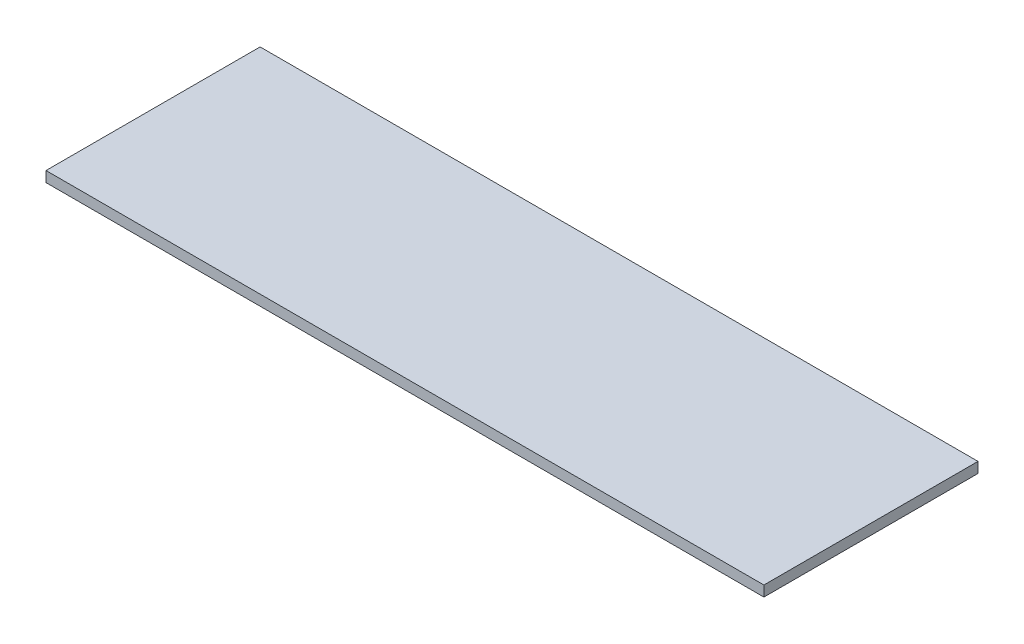
ISO-10303-21;
HEADER;
FILE_DESCRIPTION(('STEP AP214'),'2;1');
FILE_NAME('part.step','',(''),(''),'','','');
FILE_SCHEMA(('AUTOMOTIVE_DESIGN { 1 0 10303 214 1 1 1 1 }'));
ENDSEC;
DATA;
#1=APPLICATION_CONTEXT('core data for automotive mechanical design processes');
#2=APPLICATION_PROTOCOL_DEFINITION('international standard','automotive_design',2000,#1);
#3=PRODUCT_CONTEXT('',#1,'mechanical');
#4=PRODUCT('Part','Part','',(#3));
#5=PRODUCT_RELATED_PRODUCT_CATEGORY('part','',(#4));
#6=PRODUCT_DEFINITION_FORMATION('','',#4);
#7=PRODUCT_DEFINITION_CONTEXT('part definition',#1,'design');
#8=PRODUCT_DEFINITION('design','',#6,#7);
#9=PRODUCT_DEFINITION_SHAPE('','',#8);
#10=(LENGTH_UNIT() NAMED_UNIT(*) SI_UNIT(.MILLI.,.METRE.));
#11=(NAMED_UNIT(*) PLANE_ANGLE_UNIT() SI_UNIT($,.RADIAN.));
#12=(NAMED_UNIT(*) SI_UNIT($,.STERADIAN.) SOLID_ANGLE_UNIT());
#13=UNCERTAINTY_MEASURE_WITH_UNIT(LENGTH_MEASURE(1.E-05),#10,'distance_accuracy_value','');
#14=(GEOMETRIC_REPRESENTATION_CONTEXT(3) GLOBAL_UNCERTAINTY_ASSIGNED_CONTEXT((#13)) GLOBAL_UNIT_ASSIGNED_CONTEXT((#10,
#11,#12)) REPRESENTATION_CONTEXT('',''));
#15=CARTESIAN_POINT('',(0.,0.,0.));
#16=DIRECTION('',(0.,0.,1.));
#17=DIRECTION('',(1.,0.,0.));
#18=AXIS2_PLACEMENT_3D('',#15,#16,#17);
#19=CARTESIAN_POINT('',(171.,5.,-51.));
#20=DIRECTION('',(-1.,0.,0.));
#21=DIRECTION('',(0.,0.,1.));
#22=AXIS2_PLACEMENT_3D('',#19,#20,#21);
#23=PLANE('',#22);
#24=DIRECTION('',(0.,0.,-1.));
#25=VECTOR('',#24,1.);
#26=CARTESIAN_POINT('',(171.,0.,-51.));
#27=LINE('',#26,#25);
#28=CARTESIAN_POINT('',(171.,0.,51.));
#29=VERTEX_POINT('',#28);
#30=CARTESIAN_POINT('',(171.,0.,-51.));
#31=VERTEX_POINT('',#30);
#32=EDGE_CURVE('E96',#29,#31,#27,.T.);
#33=ORIENTED_EDGE('',*,*,#32,.T.);
#34=DIRECTION('',(0.,-1.,0.));
#35=VECTOR('',#34,1.);
#36=CARTESIAN_POINT('',(171.,5.,-51.));
#37=LINE('',#36,#35);
#38=CARTESIAN_POINT('',(171.,5.,-51.));
#39=VERTEX_POINT('',#38);
#40=EDGE_CURVE('E11',#39,#31,#37,.T.);
#41=ORIENTED_EDGE('',*,*,#40,.F.);
#42=DIRECTION('',(0.,0.,-1.));
#43=VECTOR('',#42,1.);
#44=CARTESIAN_POINT('',(171.,5.,-51.));
#45=LINE('',#44,#43);
#46=CARTESIAN_POINT('',(171.,5.,51.));
#47=VERTEX_POINT('',#46);
#48=EDGE_CURVE('E84',#47,#39,#45,.T.);
#49=ORIENTED_EDGE('',*,*,#48,.F.);
#50=DIRECTION('',(0.,-1.,0.));
#51=VECTOR('',#50,1.);
#52=CARTESIAN_POINT('',(171.,5.,51.));
#53=LINE('',#52,#51);
#54=EDGE_CURVE('E92',#47,#29,#53,.T.);
#55=ORIENTED_EDGE('',*,*,#54,.T.);
#56=EDGE_LOOP('',(#33,#41,#49,#55));
#57=FACE_BOUND('',#56,.T.);
#58=ADVANCED_FACE('F33',(#57),#23,.F.);
#59=CARTESIAN_POINT('',(-171.,5.,-51.));
#60=DIRECTION('',(0.,0.,1.));
#61=DIRECTION('',(1.,0.,0.));
#62=AXIS2_PLACEMENT_3D('',#59,#60,#61);
#63=PLANE('',#62);
#64=DIRECTION('',(-1.,0.,0.));
#65=VECTOR('',#64,1.);
#66=CARTESIAN_POINT('',(-171.,0.,-51.));
#67=LINE('',#66,#65);
#68=CARTESIAN_POINT('',(-171.,0.,-51.));
#69=VERTEX_POINT('',#68);
#70=EDGE_CURVE('E88',#31,#69,#67,.T.);
#71=ORIENTED_EDGE('',*,*,#70,.T.);
#72=DIRECTION('',(0.,-1.,0.));
#73=VECTOR('',#72,1.);
#74=CARTESIAN_POINT('',(-171.,5.,-51.));
#75=LINE('',#74,#73);
#76=CARTESIAN_POINT('',(-171.,5.,-51.));
#77=VERTEX_POINT('',#76);
#78=EDGE_CURVE('E41',#77,#69,#75,.T.);
#79=ORIENTED_EDGE('',*,*,#78,.F.);
#80=DIRECTION('',(-1.,0.,0.));
#81=VECTOR('',#80,1.);
#82=CARTESIAN_POINT('',(-171.,5.,-51.));
#83=LINE('',#82,#81);
#84=EDGE_CURVE('E79',#39,#77,#83,.T.);
#85=ORIENTED_EDGE('',*,*,#84,.F.);
#86=ORIENTED_EDGE('',*,*,#40,.T.);
#87=EDGE_LOOP('',(#71,#79,#85,#86));
#88=FACE_BOUND('',#87,.T.);
#89=ADVANCED_FACE('F87',(#88),#63,.F.);
#90=CARTESIAN_POINT('',(-171.,5.,-51.));
#91=DIRECTION('',(1.,0.,0.));
#92=DIRECTION('',(0.,0.,-1.));
#93=AXIS2_PLACEMENT_3D('',#90,#91,#92);
#94=PLANE('',#93);
#95=DIRECTION('',(0.,0.,1.));
#96=VECTOR('',#95,1.);
#97=CARTESIAN_POINT('',(-171.,0.,-51.));
#98=LINE('',#97,#96);
#99=CARTESIAN_POINT('',(-171.,0.,51.));
#100=VERTEX_POINT('',#99);
#101=EDGE_CURVE('E66',#69,#100,#98,.T.);
#102=ORIENTED_EDGE('',*,*,#101,.T.);
#103=DIRECTION('',(0.,-1.,0.));
#104=VECTOR('',#103,1.);
#105=CARTESIAN_POINT('',(-171.,5.,51.));
#106=LINE('',#105,#104);
#107=CARTESIAN_POINT('',(-171.,5.,51.));
#108=VERTEX_POINT('',#107);
#109=EDGE_CURVE('E89',#108,#100,#106,.T.);
#110=ORIENTED_EDGE('',*,*,#109,.F.);
#111=DIRECTION('',(0.,0.,1.));
#112=VECTOR('',#111,1.);
#113=CARTESIAN_POINT('',(-171.,5.,-51.));
#114=LINE('',#113,#112);
#115=EDGE_CURVE('E82',#77,#108,#114,.T.);
#116=ORIENTED_EDGE('',*,*,#115,.F.);
#117=ORIENTED_EDGE('',*,*,#78,.T.);
#118=EDGE_LOOP('',(#102,#110,#116,#117));
#119=FACE_BOUND('',#118,.T.);
#120=ADVANCED_FACE('F90',(#119),#94,.F.);
#121=CARTESIAN_POINT('',(-171.,5.,51.));
#122=DIRECTION('',(0.,0.,-1.));
#123=DIRECTION('',(-1.,0.,0.));
#124=AXIS2_PLACEMENT_3D('',#121,#122,#123);
#125=PLANE('',#124);
#126=DIRECTION('',(1.,0.,0.));
#127=VECTOR('',#126,1.);
#128=CARTESIAN_POINT('',(-171.,0.,51.));
#129=LINE('',#128,#127);
#130=EDGE_CURVE('E72',#100,#29,#129,.T.);
#131=ORIENTED_EDGE('',*,*,#130,.T.);
#132=ORIENTED_EDGE('',*,*,#54,.F.);
#133=DIRECTION('',(1.,0.,0.));
#134=VECTOR('',#133,1.);
#135=CARTESIAN_POINT('',(-171.,5.,51.));
#136=LINE('',#135,#134);
#137=EDGE_CURVE('E49',#108,#47,#136,.T.);
#138=ORIENTED_EDGE('',*,*,#137,.F.);
#139=ORIENTED_EDGE('',*,*,#109,.T.);
#140=EDGE_LOOP('',(#131,#132,#138,#139));
#141=FACE_BOUND('',#140,.T.);
#142=ADVANCED_FACE('F103',(#141),#125,.F.);
#143=CARTESIAN_POINT('',(0.,5.,0.));
#144=DIRECTION('',(0.,1.,0.));
#145=DIRECTION('',(0.,0.,1.));
#146=AXIS2_PLACEMENT_3D('',#143,#144,#145);
#147=PLANE('',#146);
#148=ORIENTED_EDGE('',*,*,#48,.T.);
#149=ORIENTED_EDGE('',*,*,#84,.T.);
#150=ORIENTED_EDGE('',*,*,#115,.T.);
#151=ORIENTED_EDGE('',*,*,#137,.T.);
#152=EDGE_LOOP('',(#148,#149,#150,#151));
#153=FACE_BOUND('',#152,.T.);
#154=ADVANCED_FACE('F80',(#153),#147,.T.);
#155=CARTESIAN_POINT('',(0.,0.,0.));
#156=DIRECTION('',(0.,1.,0.));
#157=DIRECTION('',(0.,0.,1.));
#158=AXIS2_PLACEMENT_3D('',#155,#156,#157);
#159=PLANE('',#158);
#160=ORIENTED_EDGE('',*,*,#32,.F.);
#161=ORIENTED_EDGE('',*,*,#130,.F.);
#162=ORIENTED_EDGE('',*,*,#101,.F.);
#163=ORIENTED_EDGE('',*,*,#70,.F.);
#164=EDGE_LOOP('',(#160,#161,#162,#163));
#165=FACE_BOUND('',#164,.T.);
#166=ADVANCED_FACE('F106',(#165),#159,.F.);
#167=CLOSED_SHELL('',(#58,#89,#120,#142,#154,#166));
#168=MANIFOLD_SOLID_BREP('B2',#167);
#169=ADVANCED_BREP_SHAPE_REPRESENTATION('',(#18,#168),#14);
#170=SHAPE_DEFINITION_REPRESENTATION(#9,#169);
ENDSEC;
END-ISO-10303-21;
